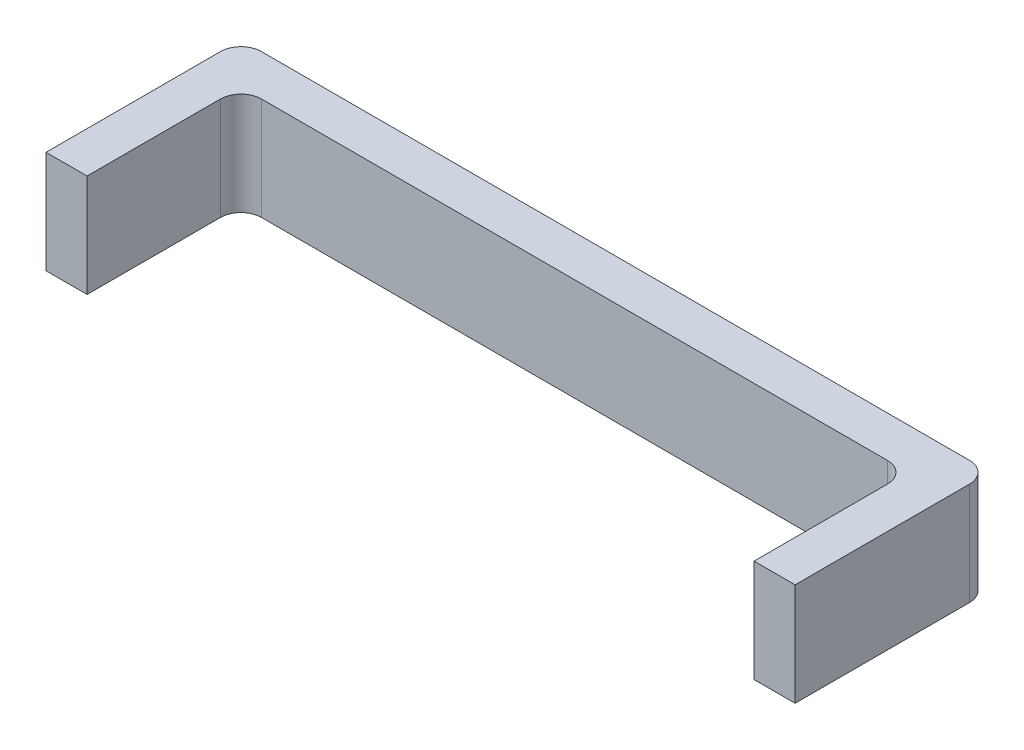
ISO-10303-21;
HEADER;
FILE_DESCRIPTION(('STEP AP214'),'2;1');
FILE_NAME('part.step','',(''),(''),'','','');
FILE_SCHEMA(('AUTOMOTIVE_DESIGN { 1 0 10303 214 1 1 1 1 }'));
ENDSEC;
DATA;
#1=APPLICATION_CONTEXT('core data for automotive mechanical design processes');
#2=APPLICATION_PROTOCOL_DEFINITION('international standard','automotive_design',2000,#1);
#3=PRODUCT_CONTEXT('',#1,'mechanical');
#4=PRODUCT('Part','Part','',(#3));
#5=PRODUCT_RELATED_PRODUCT_CATEGORY('part','',(#4));
#6=PRODUCT_DEFINITION_FORMATION('','',#4);
#7=PRODUCT_DEFINITION_CONTEXT('part definition',#1,'design');
#8=PRODUCT_DEFINITION('design','',#6,#7);
#9=PRODUCT_DEFINITION_SHAPE('','',#8);
#10=(LENGTH_UNIT() NAMED_UNIT(*) SI_UNIT(.MILLI.,.METRE.));
#11=(NAMED_UNIT(*) PLANE_ANGLE_UNIT() SI_UNIT($,.RADIAN.));
#12=(NAMED_UNIT(*) SI_UNIT($,.STERADIAN.) SOLID_ANGLE_UNIT());
#13=UNCERTAINTY_MEASURE_WITH_UNIT(LENGTH_MEASURE(1.E-05),#10,'distance_accuracy_value','');
#14=(GEOMETRIC_REPRESENTATION_CONTEXT(3) GLOBAL_UNCERTAINTY_ASSIGNED_CONTEXT((#13)) GLOBAL_UNIT_ASSIGNED_CONTEXT((#10,
#11,#12)) REPRESENTATION_CONTEXT('',''));
#15=CARTESIAN_POINT('',(0.,0.,0.));
#16=DIRECTION('',(0.,0.,1.));
#17=DIRECTION('',(1.,0.,0.));
#18=AXIS2_PLACEMENT_3D('',#15,#16,#17);
#19=CARTESIAN_POINT('',(-36.5,10.,15.));
#20=DIRECTION('',(0.,0.,-1.));
#21=DIRECTION('',(-1.,0.,0.));
#22=AXIS2_PLACEMENT_3D('',#19,#20,#21);
#23=PLANE('',#22);
#24=DIRECTION('',(1.,0.,0.));
#25=VECTOR('',#24,1.);
#26=CARTESIAN_POINT('',(-36.5,0.,15.));
#27=LINE('',#26,#25);
#28=CARTESIAN_POINT('',(-36.5,0.,15.));
#29=VERTEX_POINT('',#28);
#30=CARTESIAN_POINT('',(-32.5,0.,15.));
#31=VERTEX_POINT('',#30);
#32=EDGE_CURVE('E151',#29,#31,#27,.T.);
#33=ORIENTED_EDGE('',*,*,#32,.T.);
#34=DIRECTION('',(0.,-1.,0.));
#35=VECTOR('',#34,1.);
#36=CARTESIAN_POINT('',(-32.5,10.,15.));
#37=LINE('',#36,#35);
#38=CARTESIAN_POINT('',(-32.5,10.,15.));
#39=VERTEX_POINT('',#38);
#40=EDGE_CURVE('E132',#39,#31,#37,.T.);
#41=ORIENTED_EDGE('',*,*,#40,.F.);
#42=DIRECTION('',(1.,0.,0.));
#43=VECTOR('',#42,1.);
#44=CARTESIAN_POINT('',(-36.5,10.,15.));
#45=LINE('',#44,#43);
#46=CARTESIAN_POINT('',(-36.5,10.,15.));
#47=VERTEX_POINT('',#46);
#48=EDGE_CURVE('E138',#47,#39,#45,.T.);
#49=ORIENTED_EDGE('',*,*,#48,.F.);
#50=DIRECTION('',(0.,-1.,0.));
#51=VECTOR('',#50,1.);
#52=CARTESIAN_POINT('',(-36.5,10.,15.));
#53=LINE('',#52,#51);
#54=EDGE_CURVE('E222',#47,#29,#53,.T.);
#55=ORIENTED_EDGE('',*,*,#54,.T.);
#56=EDGE_LOOP('',(#33,#41,#49,#55));
#57=FACE_BOUND('',#56,.T.);
#58=ADVANCED_FACE('F37',(#57),#23,.F.);
#59=CARTESIAN_POINT('',(-32.5,10.,15.));
#60=DIRECTION('',(-1.,0.,0.));
#61=DIRECTION('',(0.,0.,1.));
#62=AXIS2_PLACEMENT_3D('',#59,#60,#61);
#63=PLANE('',#62);
#64=DIRECTION('',(0.,0.,-1.));
#65=VECTOR('',#64,1.);
#66=CARTESIAN_POINT('',(-32.5,0.,15.));
#67=LINE('',#66,#65);
#68=CARTESIAN_POINT('',(-32.5,0.,2.));
#69=VERTEX_POINT('',#68);
#70=EDGE_CURVE('E204',#31,#69,#67,.T.);
#71=ORIENTED_EDGE('',*,*,#70,.T.);
#72=DIRECTION('',(0.,-1.,0.));
#73=VECTOR('',#72,1.);
#74=CARTESIAN_POINT('',(-32.5,10.,2.));
#75=LINE('',#74,#73);
#76=CARTESIAN_POINT('',(-32.5,10.,2.));
#77=VERTEX_POINT('',#76);
#78=EDGE_CURVE('E135',#69,#77,#75,.F.);
#79=ORIENTED_EDGE('',*,*,#78,.T.);
#80=DIRECTION('',(0.,0.,-1.));
#81=VECTOR('',#80,1.);
#82=CARTESIAN_POINT('',(-32.5,10.,15.));
#83=LINE('',#82,#81);
#84=EDGE_CURVE('E127',#39,#77,#83,.T.);
#85=ORIENTED_EDGE('',*,*,#84,.F.);
#86=ORIENTED_EDGE('',*,*,#40,.T.);
#87=EDGE_LOOP('',(#71,#79,#85,#86));
#88=FACE_BOUND('',#87,.T.);
#89=ADVANCED_FACE('F130',(#88),#63,.F.);
#90=CARTESIAN_POINT('',(-32.5,10.,0.));
#91=DIRECTION('',(0.,0.,-1.));
#92=DIRECTION('',(-1.,0.,0.));
#93=AXIS2_PLACEMENT_3D('',#90,#91,#92);
#94=PLANE('',#93);
#95=DIRECTION('',(1.,0.,0.));
#96=VECTOR('',#95,1.);
#97=CARTESIAN_POINT('',(-32.5,10.,0.));
#98=LINE('',#97,#96);
#99=CARTESIAN_POINT('',(-30.5,10.,0.));
#100=VERTEX_POINT('',#99);
#101=CARTESIAN_POINT('',(30.5,10.,0.));
#102=VERTEX_POINT('',#101);
#103=EDGE_CURVE('E137',#100,#102,#98,.T.);
#104=ORIENTED_EDGE('',*,*,#103,.F.);
#105=DIRECTION('',(0.,-1.,0.));
#106=VECTOR('',#105,1.);
#107=CARTESIAN_POINT('',(-30.5,0.,0.));
#108=LINE('',#107,#106);
#109=CARTESIAN_POINT('',(-30.5,0.,0.));
#110=VERTEX_POINT('',#109);
#111=EDGE_CURVE('E177',#100,#110,#108,.T.);
#112=ORIENTED_EDGE('',*,*,#111,.T.);
#113=DIRECTION('',(1.,0.,0.));
#114=VECTOR('',#113,1.);
#115=CARTESIAN_POINT('',(-32.5,0.,0.));
#116=LINE('',#115,#114);
#117=CARTESIAN_POINT('',(30.5,0.,0.));
#118=VERTEX_POINT('',#117);
#119=EDGE_CURVE('E194',#110,#118,#116,.T.);
#120=ORIENTED_EDGE('',*,*,#119,.T.);
#121=DIRECTION('',(0.,-1.,0.));
#122=VECTOR('',#121,1.);
#123=CARTESIAN_POINT('',(30.5,10.,0.));
#124=LINE('',#123,#122);
#125=EDGE_CURVE('E175',#118,#102,#124,.F.);
#126=ORIENTED_EDGE('',*,*,#125,.T.);
#127=EDGE_LOOP('',(#104,#112,#120,#126));
#128=FACE_BOUND('',#127,.T.);
#129=ADVANCED_FACE('F202',(#128),#94,.F.);
#130=CARTESIAN_POINT('',(32.5,10.,0.));
#131=DIRECTION('',(1.,0.,0.));
#132=DIRECTION('',(0.,0.,-1.));
#133=AXIS2_PLACEMENT_3D('',#130,#131,#132);
#134=PLANE('',#133);
#135=DIRECTION('',(0.,0.,1.));
#136=VECTOR('',#135,1.);
#137=CARTESIAN_POINT('',(32.5,10.,0.));
#138=LINE('',#137,#136);
#139=CARTESIAN_POINT('',(32.5,10.,2.));
#140=VERTEX_POINT('',#139);
#141=CARTESIAN_POINT('',(32.5,10.,15.));
#142=VERTEX_POINT('',#141);
#143=EDGE_CURVE('E210',#140,#142,#138,.T.);
#144=ORIENTED_EDGE('',*,*,#143,.F.);
#145=DIRECTION('',(0.,-1.,0.));
#146=VECTOR('',#145,1.);
#147=CARTESIAN_POINT('',(32.5,0.,2.));
#148=LINE('',#147,#146);
#149=CARTESIAN_POINT('',(32.5,0.,2.));
#150=VERTEX_POINT('',#149);
#151=EDGE_CURVE('E181',#140,#150,#148,.T.);
#152=ORIENTED_EDGE('',*,*,#151,.T.);
#153=DIRECTION('',(0.,0.,1.));
#154=VECTOR('',#153,1.);
#155=CARTESIAN_POINT('',(32.5,0.,0.));
#156=LINE('',#155,#154);
#157=CARTESIAN_POINT('',(32.5,0.,15.));
#158=VERTEX_POINT('',#157);
#159=EDGE_CURVE('E196',#150,#158,#156,.T.);
#160=ORIENTED_EDGE('',*,*,#159,.T.);
#161=DIRECTION('',(0.,-1.,0.));
#162=VECTOR('',#161,1.);
#163=CARTESIAN_POINT('',(32.5,10.,15.));
#164=LINE('',#163,#162);
#165=EDGE_CURVE('E153',#142,#158,#164,.T.);
#166=ORIENTED_EDGE('',*,*,#165,.F.);
#167=EDGE_LOOP('',(#144,#152,#160,#166));
#168=FACE_BOUND('',#167,.T.);
#169=ADVANCED_FACE('F208',(#168),#134,.F.);
#170=CARTESIAN_POINT('',(32.5,10.,15.));
#171=DIRECTION('',(0.,0.,-1.));
#172=DIRECTION('',(-1.,0.,0.));
#173=AXIS2_PLACEMENT_3D('',#170,#171,#172);
#174=PLANE('',#173);
#175=DIRECTION('',(1.,0.,0.));
#176=VECTOR('',#175,1.);
#177=CARTESIAN_POINT('',(32.5,0.,15.));
#178=LINE('',#177,#176);
#179=CARTESIAN_POINT('',(36.5,0.,15.));
#180=VERTEX_POINT('',#179);
#181=EDGE_CURVE('E226',#158,#180,#178,.T.);
#182=ORIENTED_EDGE('',*,*,#181,.T.);
#183=DIRECTION('',(0.,-1.,0.));
#184=VECTOR('',#183,1.);
#185=CARTESIAN_POINT('',(36.5,10.,15.));
#186=LINE('',#185,#184);
#187=CARTESIAN_POINT('',(36.5,10.,15.));
#188=VERTEX_POINT('',#187);
#189=EDGE_CURVE('E159',#188,#180,#186,.T.);
#190=ORIENTED_EDGE('',*,*,#189,.F.);
#191=DIRECTION('',(1.,0.,0.));
#192=VECTOR('',#191,1.);
#193=CARTESIAN_POINT('',(32.5,10.,15.));
#194=LINE('',#193,#192);
#195=EDGE_CURVE('E212',#142,#188,#194,.T.);
#196=ORIENTED_EDGE('',*,*,#195,.F.);
#197=ORIENTED_EDGE('',*,*,#165,.T.);
#198=EDGE_LOOP('',(#182,#190,#196,#197));
#199=FACE_BOUND('',#198,.T.);
#200=ADVANCED_FACE('F273',(#199),#174,.F.);
#201=CARTESIAN_POINT('',(36.5,10.,15.));
#202=DIRECTION('',(-1.,0.,0.));
#203=DIRECTION('',(0.,0.,1.));
#204=AXIS2_PLACEMENT_3D('',#201,#202,#203);
#205=PLANE('',#204);
#206=DIRECTION('',(0.,0.,-1.));
#207=VECTOR('',#206,1.);
#208=CARTESIAN_POINT('',(36.5,0.,15.));
#209=LINE('',#208,#207);
#210=CARTESIAN_POINT('',(36.5,0.,-2.00000000000001));
#211=VERTEX_POINT('',#210);
#212=EDGE_CURVE('E228',#180,#211,#209,.T.);
#213=ORIENTED_EDGE('',*,*,#212,.T.);
#214=DIRECTION('',(0.,-1.,0.));
#215=VECTOR('',#214,1.);
#216=CARTESIAN_POINT('',(36.5,10.,-2.00000000000001));
#217=LINE('',#216,#215);
#218=CARTESIAN_POINT('',(36.5,10.,-2.00000000000001));
#219=VERTEX_POINT('',#218);
#220=EDGE_CURVE('E52',#211,#219,#217,.F.);
#221=ORIENTED_EDGE('',*,*,#220,.T.);
#222=DIRECTION('',(0.,0.,-1.));
#223=VECTOR('',#222,1.);
#224=CARTESIAN_POINT('',(36.5,10.,15.));
#225=LINE('',#224,#223);
#226=EDGE_CURVE('E214',#188,#219,#225,.T.);
#227=ORIENTED_EDGE('',*,*,#226,.F.);
#228=ORIENTED_EDGE('',*,*,#189,.T.);
#229=EDGE_LOOP('',(#213,#221,#227,#228));
#230=FACE_BOUND('',#229,.T.);
#231=ADVANCED_FACE('F237',(#230),#205,.F.);
#232=CARTESIAN_POINT('',(36.5,10.,-4.));
#233=DIRECTION('',(0.,0.,1.));
#234=DIRECTION('',(1.,0.,0.));
#235=AXIS2_PLACEMENT_3D('',#232,#233,#234);
#236=PLANE('',#235);
#237=DIRECTION('',(-1.,0.,0.));
#238=VECTOR('',#237,1.);
#239=CARTESIAN_POINT('',(36.5,0.,-4.));
#240=LINE('',#239,#238);
#241=CARTESIAN_POINT('',(34.5,0.,-4.));
#242=VERTEX_POINT('',#241);
#243=CARTESIAN_POINT('',(-34.5,0.,-3.99999999999999));
#244=VERTEX_POINT('',#243);
#245=EDGE_CURVE('E230',#242,#244,#240,.T.);
#246=ORIENTED_EDGE('',*,*,#245,.T.);
#247=DIRECTION('',(0.,-1.,0.));
#248=VECTOR('',#247,1.);
#249=CARTESIAN_POINT('',(-34.5,10.,-3.99999999999999));
#250=LINE('',#249,#248);
#251=CARTESIAN_POINT('',(-34.5,10.,-3.99999999999999));
#252=VERTEX_POINT('',#251);
#253=EDGE_CURVE('E169',#244,#252,#250,.F.);
#254=ORIENTED_EDGE('',*,*,#253,.T.);
#255=DIRECTION('',(-1.,0.,0.));
#256=VECTOR('',#255,1.);
#257=CARTESIAN_POINT('',(36.5,10.,-4.));
#258=LINE('',#257,#256);
#259=CARTESIAN_POINT('',(34.5,10.,-4.));
#260=VERTEX_POINT('',#259);
#261=EDGE_CURVE('E219',#260,#252,#258,.T.);
#262=ORIENTED_EDGE('',*,*,#261,.F.);
#263=DIRECTION('',(0.,-1.,0.));
#264=VECTOR('',#263,1.);
#265=CARTESIAN_POINT('',(34.5,10.,-4.));
#266=LINE('',#265,#264);
#267=EDGE_CURVE('E166',#260,#242,#266,.T.);
#268=ORIENTED_EDGE('',*,*,#267,.T.);
#269=EDGE_LOOP('',(#246,#254,#262,#268));
#270=FACE_BOUND('',#269,.T.);
#271=ADVANCED_FACE('F245',(#270),#236,.F.);
#272=CARTESIAN_POINT('',(-36.5,10.,-3.99999999999999));
#273=DIRECTION('',(1.,0.,0.));
#274=DIRECTION('',(0.,0.,-1.));
#275=AXIS2_PLACEMENT_3D('',#272,#273,#274);
#276=PLANE('',#275);
#277=DIRECTION('',(0.,0.,1.));
#278=VECTOR('',#277,1.);
#279=CARTESIAN_POINT('',(-36.5,10.,-3.99999999999999));
#280=LINE('',#279,#278);
#281=CARTESIAN_POINT('',(-36.5,10.,-1.99999999999999));
#282=VERTEX_POINT('',#281);
#283=EDGE_CURVE('E144',#282,#47,#280,.T.);
#284=ORIENTED_EDGE('',*,*,#283,.F.);
#285=DIRECTION('',(0.,-1.,0.));
#286=VECTOR('',#285,1.);
#287=CARTESIAN_POINT('',(-36.5,10.,-1.99999999999999));
#288=LINE('',#287,#286);
#289=CARTESIAN_POINT('',(-36.5,0.,-1.99999999999999));
#290=VERTEX_POINT('',#289);
#291=EDGE_CURVE('E152',#282,#290,#288,.T.);
#292=ORIENTED_EDGE('',*,*,#291,.T.);
#293=DIRECTION('',(0.,0.,1.));
#294=VECTOR('',#293,1.);
#295=CARTESIAN_POINT('',(-36.5,0.,-3.99999999999999));
#296=LINE('',#295,#294);
#297=EDGE_CURVE('E148',#290,#29,#296,.T.);
#298=ORIENTED_EDGE('',*,*,#297,.T.);
#299=ORIENTED_EDGE('',*,*,#54,.F.);
#300=EDGE_LOOP('',(#284,#292,#298,#299));
#301=FACE_BOUND('',#300,.T.);
#302=ADVANCED_FACE('F252',(#301),#276,.F.);
#303=CARTESIAN_POINT('',(0.,10.,0.));
#304=DIRECTION('',(0.,1.,0.));
#305=DIRECTION('',(0.,0.,1.));
#306=AXIS2_PLACEMENT_3D('',#303,#304,#305);
#307=PLANE('',#306);
#308=ORIENTED_EDGE('',*,*,#261,.T.);
#309=CARTESIAN_POINT('',(-34.5,10.,-1.99999999999999));
#310=DIRECTION('',(0.,1.,0.));
#311=DIRECTION('',(0.,0.,1.));
#312=AXIS2_PLACEMENT_3D('',#309,#310,#311);
#313=CIRCLE('',#312,2.);
#314=EDGE_CURVE('E173',#252,#282,#313,.T.);
#315=ORIENTED_EDGE('',*,*,#314,.T.);
#316=ORIENTED_EDGE('',*,*,#283,.T.);
#317=ORIENTED_EDGE('',*,*,#48,.T.);
#318=ORIENTED_EDGE('',*,*,#84,.T.);
#319=CARTESIAN_POINT('',(-30.5,10.,2.));
#320=DIRECTION('',(0.,1.,0.));
#321=DIRECTION('',(0.,0.,1.));
#322=AXIS2_PLACEMENT_3D('',#319,#320,#321);
#323=CIRCLE('',#322,2.);
#324=EDGE_CURVE('E187',#77,#100,#323,.F.);
#325=ORIENTED_EDGE('',*,*,#324,.T.);
#326=ORIENTED_EDGE('',*,*,#103,.T.);
#327=CARTESIAN_POINT('',(30.5,10.,2.));
#328=DIRECTION('',(0.,1.,0.));
#329=DIRECTION('',(0.,0.,1.));
#330=AXIS2_PLACEMENT_3D('',#327,#328,#329);
#331=CIRCLE('',#330,2.);
#332=EDGE_CURVE('E11',#102,#140,#331,.F.);
#333=ORIENTED_EDGE('',*,*,#332,.T.);
#334=ORIENTED_EDGE('',*,*,#143,.T.);
#335=ORIENTED_EDGE('',*,*,#195,.T.);
#336=ORIENTED_EDGE('',*,*,#226,.T.);
#337=CARTESIAN_POINT('',(34.5,10.,-2.));
#338=DIRECTION('',(0.,1.,0.));
#339=DIRECTION('',(0.,0.,1.));
#340=AXIS2_PLACEMENT_3D('',#337,#338,#339);
#341=CIRCLE('',#340,2.);
#342=EDGE_CURVE('E171',#219,#260,#341,.T.);
#343=ORIENTED_EDGE('',*,*,#342,.T.);
#344=EDGE_LOOP('',(#308,#315,#316,#317,#318,#325,#326,#333,#334,#335,#336,#343));
#345=FACE_BOUND('',#344,.T.);
#346=ADVANCED_FACE('F142',(#345),#307,.T.);
#347=CARTESIAN_POINT('',(0.,0.,0.));
#348=DIRECTION('',(0.,1.,0.));
#349=DIRECTION('',(0.,0.,1.));
#350=AXIS2_PLACEMENT_3D('',#347,#348,#349);
#351=PLANE('',#350);
#352=ORIENTED_EDGE('',*,*,#297,.F.);
#353=CARTESIAN_POINT('',(-34.5,0.,-1.99999999999999));
#354=DIRECTION('',(0.,1.,0.));
#355=DIRECTION('',(0.,0.,1.));
#356=AXIS2_PLACEMENT_3D('',#353,#354,#355);
#357=CIRCLE('',#356,2.);
#358=EDGE_CURVE('E164',#290,#244,#357,.F.);
#359=ORIENTED_EDGE('',*,*,#358,.T.);
#360=ORIENTED_EDGE('',*,*,#245,.F.);
#361=CARTESIAN_POINT('',(34.5,0.,-2.));
#362=DIRECTION('',(0.,1.,0.));
#363=DIRECTION('',(0.,0.,1.));
#364=AXIS2_PLACEMENT_3D('',#361,#362,#363);
#365=CIRCLE('',#364,2.);
#366=EDGE_CURVE('E156',#242,#211,#365,.F.);
#367=ORIENTED_EDGE('',*,*,#366,.T.);
#368=ORIENTED_EDGE('',*,*,#212,.F.);
#369=ORIENTED_EDGE('',*,*,#181,.F.);
#370=ORIENTED_EDGE('',*,*,#159,.F.);
#371=CARTESIAN_POINT('',(30.5,0.,2.));
#372=DIRECTION('',(0.,1.,0.));
#373=DIRECTION('',(0.,0.,1.));
#374=AXIS2_PLACEMENT_3D('',#371,#372,#373);
#375=CIRCLE('',#374,2.);
#376=EDGE_CURVE('E45',#150,#118,#375,.T.);
#377=ORIENTED_EDGE('',*,*,#376,.T.);
#378=ORIENTED_EDGE('',*,*,#119,.F.);
#379=CARTESIAN_POINT('',(-30.5,0.,2.));
#380=DIRECTION('',(0.,1.,0.));
#381=DIRECTION('',(0.,0.,1.));
#382=AXIS2_PLACEMENT_3D('',#379,#380,#381);
#383=CIRCLE('',#382,2.);
#384=EDGE_CURVE('E185',#110,#69,#383,.T.);
#385=ORIENTED_EDGE('',*,*,#384,.T.);
#386=ORIENTED_EDGE('',*,*,#70,.F.);
#387=ORIENTED_EDGE('',*,*,#32,.F.);
#388=EDGE_LOOP('',(#352,#359,#360,#367,#368,#369,#370,#377,#378,#385,#386,#387));
#389=FACE_BOUND('',#388,.T.);
#390=ADVANCED_FACE('F193',(#389),#351,.F.);
#391=CARTESIAN_POINT('',(-34.5,10.,-1.99999999999999));
#392=DIRECTION('',(0.,-1.,0.));
#393=DIRECTION('',(0.,0.,-1.));
#394=AXIS2_PLACEMENT_3D('',#391,#392,#393);
#395=CYLINDRICAL_SURFACE('',#394,2.);
#396=ORIENTED_EDGE('',*,*,#314,.F.);
#397=ORIENTED_EDGE('',*,*,#253,.F.);
#398=ORIENTED_EDGE('',*,*,#358,.F.);
#399=ORIENTED_EDGE('',*,*,#291,.F.);
#400=EDGE_LOOP('',(#396,#397,#398,#399));
#401=FACE_BOUND('',#400,.T.);
#402=ADVANCED_FACE('F250',(#401),#395,.T.);
#403=CARTESIAN_POINT('',(-30.5,10.,2.));
#404=DIRECTION('',(0.,1.,0.));
#405=DIRECTION('',(0.,0.,1.));
#406=AXIS2_PLACEMENT_3D('',#403,#404,#405);
#407=CYLINDRICAL_SURFACE('',#406,2.);
#408=ORIENTED_EDGE('',*,*,#324,.F.);
#409=ORIENTED_EDGE('',*,*,#78,.F.);
#410=ORIENTED_EDGE('',*,*,#384,.F.);
#411=ORIENTED_EDGE('',*,*,#111,.F.);
#412=EDGE_LOOP('',(#408,#409,#410,#411));
#413=FACE_BOUND('',#412,.T.);
#414=ADVANCED_FACE('F254',(#413),#407,.F.);
#415=CARTESIAN_POINT('',(30.5,10.,2.));
#416=DIRECTION('',(0.,1.,0.));
#417=DIRECTION('',(0.,0.,1.));
#418=AXIS2_PLACEMENT_3D('',#415,#416,#417);
#419=CYLINDRICAL_SURFACE('',#418,2.);
#420=ORIENTED_EDGE('',*,*,#332,.F.);
#421=ORIENTED_EDGE('',*,*,#125,.F.);
#422=ORIENTED_EDGE('',*,*,#376,.F.);
#423=ORIENTED_EDGE('',*,*,#151,.F.);
#424=EDGE_LOOP('',(#420,#421,#422,#423));
#425=FACE_BOUND('',#424,.T.);
#426=ADVANCED_FACE('F206',(#425),#419,.F.);
#427=CARTESIAN_POINT('',(34.5,10.,-2.));
#428=DIRECTION('',(0.,-1.,0.));
#429=DIRECTION('',(0.,0.,-1.));
#430=AXIS2_PLACEMENT_3D('',#427,#428,#429);
#431=CYLINDRICAL_SURFACE('',#430,2.);
#432=ORIENTED_EDGE('',*,*,#342,.F.);
#433=ORIENTED_EDGE('',*,*,#220,.F.);
#434=ORIENTED_EDGE('',*,*,#366,.F.);
#435=ORIENTED_EDGE('',*,*,#267,.F.);
#436=EDGE_LOOP('',(#432,#433,#434,#435));
#437=FACE_BOUND('',#436,.T.);
#438=ADVANCED_FACE('F39',(#437),#431,.T.);
#439=CLOSED_SHELL('',(#58,#89,#129,#169,#200,#231,#271,#302,#346,#390,#402,#414,#426,#438));
#440=MANIFOLD_SOLID_BREP('B2',#439);
#441=ADVANCED_BREP_SHAPE_REPRESENTATION('',(#18,#440),#14);
#442=SHAPE_DEFINITION_REPRESENTATION(#9,#441);
ENDSEC;
END-ISO-10303-21;
